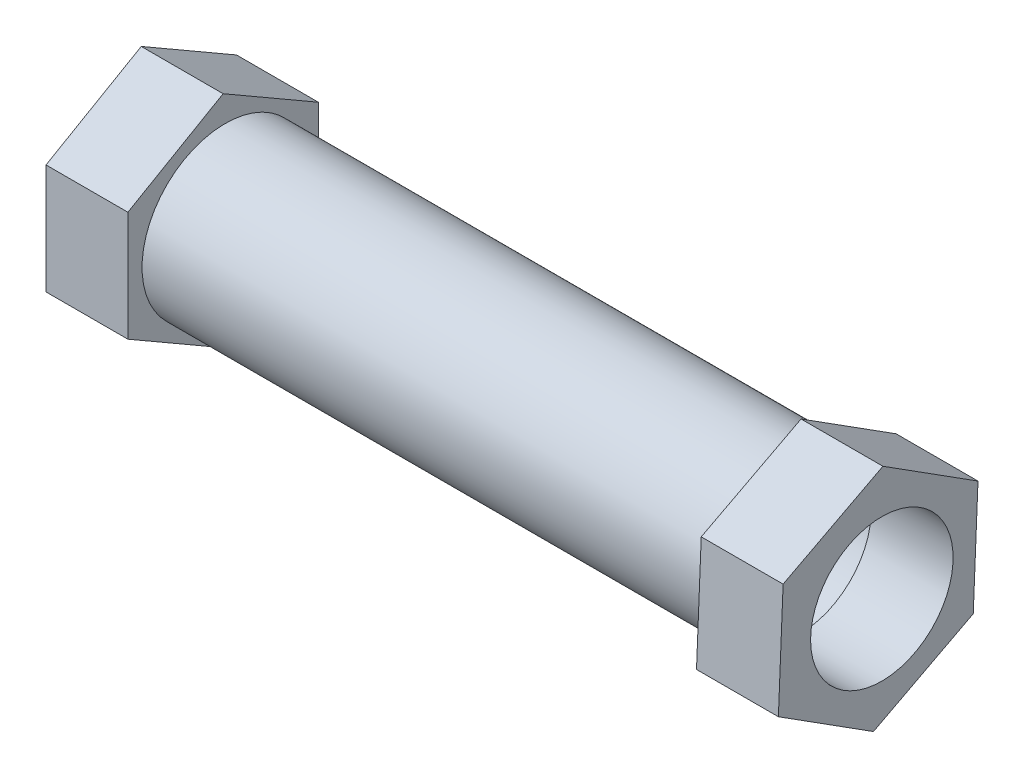
ISO-10303-21;
HEADER;
FILE_DESCRIPTION(('STEP AP214'),'2;1');
FILE_NAME('part.step','',(''),(''),'','','');
FILE_SCHEMA(('AUTOMOTIVE_DESIGN { 1 0 10303 214 1 1 1 1 }'));
ENDSEC;
DATA;
#1=APPLICATION_CONTEXT('core data for automotive mechanical design processes');
#2=APPLICATION_PROTOCOL_DEFINITION('international standard','automotive_design',2000,#1);
#3=PRODUCT_CONTEXT('',#1,'mechanical');
#4=PRODUCT('Part','Part','',(#3));
#5=PRODUCT_RELATED_PRODUCT_CATEGORY('part','',(#4));
#6=PRODUCT_DEFINITION_FORMATION('','',#4);
#7=PRODUCT_DEFINITION_CONTEXT('part definition',#1,'design');
#8=PRODUCT_DEFINITION('design','',#6,#7);
#9=PRODUCT_DEFINITION_SHAPE('','',#8);
#10=(LENGTH_UNIT() NAMED_UNIT(*) SI_UNIT(.MILLI.,.METRE.));
#11=(NAMED_UNIT(*) PLANE_ANGLE_UNIT() SI_UNIT($,.RADIAN.));
#12=(NAMED_UNIT(*) SI_UNIT($,.STERADIAN.) SOLID_ANGLE_UNIT());
#13=UNCERTAINTY_MEASURE_WITH_UNIT(LENGTH_MEASURE(1.E-05),#10,'distance_accuracy_value','');
#14=(GEOMETRIC_REPRESENTATION_CONTEXT(3) GLOBAL_UNCERTAINTY_ASSIGNED_CONTEXT((#13)) GLOBAL_UNIT_ASSIGNED_CONTEXT((#10,
#11,#12)) REPRESENTATION_CONTEXT('',''));
#15=CARTESIAN_POINT('',(0.,0.,0.));
#16=DIRECTION('',(0.,0.,1.));
#17=DIRECTION('',(1.,0.,0.));
#18=AXIS2_PLACEMENT_3D('',#15,#16,#17);
#19=CARTESIAN_POINT('',(350.,0.,-1.28970231793346));
#20=DIRECTION('',(-1.,0.,0.));
#21=DIRECTION('',(0.,0.,1.));
#22=AXIS2_PLACEMENT_3D('',#19,#20,#21);
#23=CYLINDRICAL_SURFACE('',#22,50.8003751134074);
#24=CARTESIAN_POINT('',(350.,0.,-1.28970231793346));
#25=DIRECTION('',(1.,0.,0.));
#26=DIRECTION('',(0.,0.,-1.));
#27=AXIS2_PLACEMENT_3D('',#24,#25,#26);
#28=CIRCLE('',#27,50.8003751134074);
#29=CARTESIAN_POINT('',(350.,0.,-52.0900774313409));
#30=VERTEX_POINT('',#29);
#31=EDGE_CURVE('E11',#30,#30,#28,.T.);
#32=ORIENTED_EDGE('',*,*,#31,.F.);
#33=EDGE_LOOP('',(#32));
#34=FACE_BOUND('',#33,.T.);
#35=CARTESIAN_POINT('',(0.,0.,-1.28970231793346));
#36=DIRECTION('',(1.,0.,0.));
#37=DIRECTION('',(0.,0.,-1.));
#38=AXIS2_PLACEMENT_3D('',#35,#36,#37);
#39=CIRCLE('',#38,50.8003751134074);
#40=CARTESIAN_POINT('',(0.,0.,-52.0900774313409));
#41=VERTEX_POINT('',#40);
#42=EDGE_CURVE('E36',#41,#41,#39,.T.);
#43=ORIENTED_EDGE('',*,*,#42,.T.);
#44=EDGE_LOOP('',(#43));
#45=FACE_BOUND('',#44,.T.);
#46=ADVANCED_FACE('F33',(#34,#45),#23,.T.);
#47=CARTESIAN_POINT('',(350.,0.,-1.28970231793346));
#48=DIRECTION('',(-1.,0.,0.));
#49=DIRECTION('',(0.,0.,1.));
#50=AXIS2_PLACEMENT_3D('',#47,#48,#49);
#51=CYLINDRICAL_SURFACE('',#50,47.812951640793);
#52=CARTESIAN_POINT('',(350.,0.,-1.28970231793346));
#53=DIRECTION('',(1.,0.,0.));
#54=DIRECTION('',(0.,0.,-1.));
#55=AXIS2_PLACEMENT_3D('',#52,#53,#54);
#56=CIRCLE('',#55,47.812951640793);
#57=CARTESIAN_POINT('',(350.,0.,-49.1026539587264));
#58=VERTEX_POINT('',#57);
#59=EDGE_CURVE('E142',#58,#58,#56,.T.);
#60=ORIENTED_EDGE('',*,*,#59,.T.);
#61=EDGE_LOOP('',(#60));
#62=FACE_BOUND('',#61,.T.);
#63=CARTESIAN_POINT('',(0.,0.,-1.28970231793346));
#64=DIRECTION('',(1.,0.,0.));
#65=DIRECTION('',(0.,0.,-1.));
#66=AXIS2_PLACEMENT_3D('',#63,#64,#65);
#67=CIRCLE('',#66,47.812951640793);
#68=CARTESIAN_POINT('',(0.,0.,-49.1026539587264));
#69=VERTEX_POINT('',#68);
#70=EDGE_CURVE('E42',#69,#69,#67,.T.);
#71=ORIENTED_EDGE('',*,*,#70,.F.);
#72=EDGE_LOOP('',(#71));
#73=FACE_BOUND('',#72,.T.);
#74=ADVANCED_FACE('F150',(#62,#73),#51,.F.);
#75=CARTESIAN_POINT('',(350.,0.,0.));
#76=DIRECTION('',(1.,0.,0.));
#77=DIRECTION('',(0.,0.,-1.));
#78=AXIS2_PLACEMENT_3D('',#75,#76,#77);
#79=PLANE('',#78);
#80=CARTESIAN_POINT('',(350.,-1.09442531969695,-2.23147845243465));
#81=DIRECTION('',(-1.,0.,0.));
#82=DIRECTION('',(0.,0.,1.));
#83=AXIS2_PLACEMENT_3D('',#80,#81,#82);
#84=CIRCLE('',#83,43.5178984979552);
#85=CARTESIAN_POINT('',(350.,-1.09442531969695,41.2864200455205));
#86=VERTEX_POINT('',#85);
#87=EDGE_CURVE('E233',#86,#86,#84,.T.);
#88=ORIENTED_EDGE('',*,*,#87,.F.);
#89=EDGE_LOOP('',(#88));
#90=FACE_BOUND('',#89,.T.);
#91=ORIENTED_EDGE('',*,*,#59,.F.);
#92=EDGE_LOOP('',(#91));
#93=FACE_BOUND('',#92,.T.);
#94=ADVANCED_FACE('F152',(#90,#93),#79,.F.);
#95=CARTESIAN_POINT('',(400.,0.,0.));
#96=DIRECTION('',(1.,0.,0.));
#97=DIRECTION('',(0.,0.,-1.));
#98=AXIS2_PLACEMENT_3D('',#95,#96,#97);
#99=PLANE('',#98);
#100=CARTESIAN_POINT('',(400.,-1.09442531969695,-2.23147845243465));
#101=DIRECTION('',(-1.,0.,0.));
#102=DIRECTION('',(0.,0.,1.));
#103=AXIS2_PLACEMENT_3D('',#100,#101,#102);
#104=CIRCLE('',#103,43.5178984979552);
#105=CARTESIAN_POINT('',(400.,-1.09442531969695,41.2864200455205));
#106=VERTEX_POINT('',#105);
#107=EDGE_CURVE('E230',#106,#106,#104,.T.);
#108=ORIENTED_EDGE('',*,*,#107,.T.);
#109=EDGE_LOOP('',(#108));
#110=FACE_BOUND('',#109,.T.);
#111=DIRECTION('',(0.,0.463163450714565,-0.886272880055673));
#112=VECTOR('',#111,1.);
#113=CARTESIAN_POINT('',(400.,-68.7053503173919,2.88990405047424));
#114=LINE('',#113,#112);
#115=CARTESIAN_POINT('',(400.,-68.7053503173919,2.88990405047424));
#116=VERTEX_POINT('',#115);
#117=CARTESIAN_POINT('',(400.,-36.8554054809062,-58.0556267255335));
#118=VERTEX_POINT('',#117);
#119=EDGE_CURVE('E133',#116,#118,#114,.T.);
#120=ORIENTED_EDGE('',*,*,#119,.T.);
#121=DIRECTION('',(0.,0.999116554170694,-0.0420251256045614));
#122=VECTOR('',#121,1.);
#123=CARTESIAN_POINT('',(400.,-36.8554054809062,-58.0556267255335));
#124=LINE('',#123,#122);
#125=CARTESIAN_POINT('',(400.,31.8499448364857,-60.9455307760078));
#126=VERTEX_POINT('',#125);
#127=EDGE_CURVE('E89',#118,#126,#124,.T.);
#128=ORIENTED_EDGE('',*,*,#127,.T.);
#129=DIRECTION('',(0.,0.535953103456129,0.844247754451111));
#130=VECTOR('',#129,1.);
#131=CARTESIAN_POINT('',(400.,31.8499448364857,-60.9455307760078));
#132=LINE('',#131,#130);
#133=CARTESIAN_POINT('',(400.,68.7053503173919,-2.88990405047429));
#134=VERTEX_POINT('',#133);
#135=EDGE_CURVE('E105',#126,#134,#132,.T.);
#136=ORIENTED_EDGE('',*,*,#135,.T.);
#137=DIRECTION('',(0.,-0.463163450714565,0.886272880055673));
#138=VECTOR('',#137,1.);
#139=CARTESIAN_POINT('',(400.,68.7053503173919,-2.88990405047429));
#140=LINE('',#139,#138);
#141=CARTESIAN_POINT('',(400.,36.8554054809062,58.0556267255335));
#142=VERTEX_POINT('',#141);
#143=EDGE_CURVE('E99',#134,#142,#140,.T.);
#144=ORIENTED_EDGE('',*,*,#143,.T.);
#145=DIRECTION('',(0.,-0.999116554170694,0.0420251256045615));
#146=VECTOR('',#145,1.);
#147=CARTESIAN_POINT('',(400.,36.8554054809062,58.0556267255335));
#148=LINE('',#147,#146);
#149=CARTESIAN_POINT('',(400.,-31.8499448364857,60.9455307760078));
#150=VERTEX_POINT('',#149);
#151=EDGE_CURVE('E103',#142,#150,#148,.T.);
#152=ORIENTED_EDGE('',*,*,#151,.T.);
#153=DIRECTION('',(0.,-0.535953103456129,-0.844247754451111));
#154=VECTOR('',#153,1.);
#155=CARTESIAN_POINT('',(400.,-31.8499448364857,60.9455307760078));
#156=LINE('',#155,#154);
#157=EDGE_CURVE('E50',#150,#116,#156,.T.);
#158=ORIENTED_EDGE('',*,*,#157,.T.);
#159=EDGE_LOOP('',(#120,#128,#136,#144,#152,#158));
#160=FACE_BOUND('',#159,.T.);
#161=ADVANCED_FACE('F101',(#110,#160),#99,.T.);
#162=ORIENTED_EDGE('',*,*,#31,.T.);
#163=EDGE_LOOP('',(#162));
#164=FACE_BOUND('',#163,.T.);
#165=DIRECTION('',(0.,0.463163450714565,-0.886272880055673));
#166=VECTOR('',#165,1.);
#167=CARTESIAN_POINT('',(350.,-68.7053503173919,2.88990405047424));
#168=LINE('',#167,#166);
#169=CARTESIAN_POINT('',(350.,-68.7053503173919,2.88990405047424));
#170=VERTEX_POINT('',#169);
#171=CARTESIAN_POINT('',(350.,-36.8554054809062,-58.0556267255335));
#172=VERTEX_POINT('',#171);
#173=EDGE_CURVE('E123',#170,#172,#168,.T.);
#174=ORIENTED_EDGE('',*,*,#173,.F.);
#175=DIRECTION('',(0.,-0.535953103456129,-0.844247754451111));
#176=VECTOR('',#175,1.);
#177=CARTESIAN_POINT('',(350.,-31.8499448364857,60.9455307760078));
#178=LINE('',#177,#176);
#179=CARTESIAN_POINT('',(350.,-31.8499448364857,60.9455307760078));
#180=VERTEX_POINT('',#179);
#181=EDGE_CURVE('E80',#180,#170,#178,.T.);
#182=ORIENTED_EDGE('',*,*,#181,.F.);
#183=DIRECTION('',(0.,-0.999116554170694,0.0420251256045615));
#184=VECTOR('',#183,1.);
#185=CARTESIAN_POINT('',(350.,36.8554054809062,58.0556267255335));
#186=LINE('',#185,#184);
#187=CARTESIAN_POINT('',(350.,36.8554054809062,58.0556267255335));
#188=VERTEX_POINT('',#187);
#189=EDGE_CURVE('E74',#188,#180,#186,.T.);
#190=ORIENTED_EDGE('',*,*,#189,.F.);
#191=DIRECTION('',(0.,-0.463163450714565,0.886272880055673));
#192=VECTOR('',#191,1.);
#193=CARTESIAN_POINT('',(350.,68.7053503173919,-2.88990405047429));
#194=LINE('',#193,#192);
#195=CARTESIAN_POINT('',(350.,68.7053503173919,-2.88990405047429));
#196=VERTEX_POINT('',#195);
#197=EDGE_CURVE('E113',#196,#188,#194,.T.);
#198=ORIENTED_EDGE('',*,*,#197,.F.);
#199=DIRECTION('',(0.,0.535953103456129,0.844247754451111));
#200=VECTOR('',#199,1.);
#201=CARTESIAN_POINT('',(350.,31.8499448364857,-60.9455307760078));
#202=LINE('',#201,#200);
#203=CARTESIAN_POINT('',(350.,31.8499448364857,-60.9455307760078));
#204=VERTEX_POINT('',#203);
#205=EDGE_CURVE('E128',#204,#196,#202,.T.);
#206=ORIENTED_EDGE('',*,*,#205,.F.);
#207=DIRECTION('',(0.,0.999116554170694,-0.0420251256045614));
#208=VECTOR('',#207,1.);
#209=CARTESIAN_POINT('',(350.,-36.8554054809062,-58.0556267255335));
#210=LINE('',#209,#208);
#211=EDGE_CURVE('E126',#172,#204,#210,.T.);
#212=ORIENTED_EDGE('',*,*,#211,.F.);
#213=EDGE_LOOP('',(#174,#182,#190,#198,#206,#212));
#214=FACE_BOUND('',#213,.T.);
#215=ADVANCED_FACE('F160',(#164,#214),#79,.F.);
#216=CARTESIAN_POINT('',(400.,-68.7053503173919,2.88990405047424));
#217=DIRECTION('',(0.,0.886272880055673,0.463163450714565));
#218=DIRECTION('',(0.,-0.463163450714565,0.886272880055673));
#219=AXIS2_PLACEMENT_3D('',#216,#217,#218);
#220=PLANE('',#219);
#221=ORIENTED_EDGE('',*,*,#173,.T.);
#222=DIRECTION('',(-1.,0.,0.));
#223=VECTOR('',#222,1.);
#224=CARTESIAN_POINT('',(400.,-36.8554054809062,-58.0556267255335));
#225=LINE('',#224,#223);
#226=EDGE_CURVE('E140',#118,#172,#225,.T.);
#227=ORIENTED_EDGE('',*,*,#226,.F.);
#228=ORIENTED_EDGE('',*,*,#119,.F.);
#229=DIRECTION('',(-1.,0.,0.));
#230=VECTOR('',#229,1.);
#231=CARTESIAN_POINT('',(400.,-68.7053503173919,2.88990405047424));
#232=LINE('',#231,#230);
#233=EDGE_CURVE('E119',#116,#170,#232,.T.);
#234=ORIENTED_EDGE('',*,*,#233,.T.);
#235=EDGE_LOOP('',(#221,#227,#228,#234));
#236=FACE_BOUND('',#235,.T.);
#237=ADVANCED_FACE('F163',(#236),#220,.F.);
#238=CARTESIAN_POINT('',(400.,-36.8554054809062,-58.0556267255335));
#239=DIRECTION('',(0.,0.0420251256045614,0.999116554170694));
#240=DIRECTION('',(0.,-0.999116554170694,0.0420251256045614));
#241=AXIS2_PLACEMENT_3D('',#238,#239,#240);
#242=PLANE('',#241);
#243=ORIENTED_EDGE('',*,*,#211,.T.);
#244=DIRECTION('',(-1.,0.,0.));
#245=VECTOR('',#244,1.);
#246=CARTESIAN_POINT('',(400.,31.8499448364857,-60.9455307760078));
#247=LINE('',#246,#245);
#248=EDGE_CURVE('E137',#126,#204,#247,.T.);
#249=ORIENTED_EDGE('',*,*,#248,.F.);
#250=ORIENTED_EDGE('',*,*,#127,.F.);
#251=ORIENTED_EDGE('',*,*,#226,.T.);
#252=EDGE_LOOP('',(#243,#249,#250,#251));
#253=FACE_BOUND('',#252,.T.);
#254=ADVANCED_FACE('F166',(#253),#242,.F.);
#255=CARTESIAN_POINT('',(400.,31.8499448364857,-60.9455307760078));
#256=DIRECTION('',(0.,-0.844247754451111,0.535953103456129));
#257=DIRECTION('',(0.,-0.535953103456129,-0.844247754451111));
#258=AXIS2_PLACEMENT_3D('',#255,#256,#257);
#259=PLANE('',#258);
#260=ORIENTED_EDGE('',*,*,#205,.T.);
#261=DIRECTION('',(-1.,0.,0.));
#262=VECTOR('',#261,1.);
#263=CARTESIAN_POINT('',(400.,68.7053503173919,-2.88990405047429));
#264=LINE('',#263,#262);
#265=EDGE_CURVE('E114',#134,#196,#264,.T.);
#266=ORIENTED_EDGE('',*,*,#265,.F.);
#267=ORIENTED_EDGE('',*,*,#135,.F.);
#268=ORIENTED_EDGE('',*,*,#248,.T.);
#269=EDGE_LOOP('',(#260,#266,#267,#268));
#270=FACE_BOUND('',#269,.T.);
#271=ADVANCED_FACE('F170',(#270),#259,.F.);
#272=CARTESIAN_POINT('',(400.,68.7053503173919,-2.88990405047429));
#273=DIRECTION('',(0.,-0.886272880055673,-0.463163450714565));
#274=DIRECTION('',(0.,0.463163450714565,-0.886272880055673));
#275=AXIS2_PLACEMENT_3D('',#272,#273,#274);
#276=PLANE('',#275);
#277=ORIENTED_EDGE('',*,*,#197,.T.);
#278=DIRECTION('',(-1.,0.,0.));
#279=VECTOR('',#278,1.);
#280=CARTESIAN_POINT('',(400.,36.8554054809062,58.0556267255335));
#281=LINE('',#280,#279);
#282=EDGE_CURVE('E110',#142,#188,#281,.T.);
#283=ORIENTED_EDGE('',*,*,#282,.F.);
#284=ORIENTED_EDGE('',*,*,#143,.F.);
#285=ORIENTED_EDGE('',*,*,#265,.T.);
#286=EDGE_LOOP('',(#277,#283,#284,#285));
#287=FACE_BOUND('',#286,.T.);
#288=ADVANCED_FACE('F111',(#287),#276,.F.);
#289=CARTESIAN_POINT('',(400.,36.8554054809062,58.0556267255335));
#290=DIRECTION('',(0.,-0.0420251256045615,-0.999116554170694));
#291=DIRECTION('',(0.,0.999116554170694,-0.0420251256045615));
#292=AXIS2_PLACEMENT_3D('',#289,#290,#291);
#293=PLANE('',#292);
#294=ORIENTED_EDGE('',*,*,#189,.T.);
#295=DIRECTION('',(-1.,0.,0.));
#296=VECTOR('',#295,1.);
#297=CARTESIAN_POINT('',(400.,-31.8499448364857,60.9455307760078));
#298=LINE('',#297,#296);
#299=EDGE_CURVE('E115',#150,#180,#298,.T.);
#300=ORIENTED_EDGE('',*,*,#299,.F.);
#301=ORIENTED_EDGE('',*,*,#151,.F.);
#302=ORIENTED_EDGE('',*,*,#282,.T.);
#303=EDGE_LOOP('',(#294,#300,#301,#302));
#304=FACE_BOUND('',#303,.T.);
#305=ADVANCED_FACE('F117',(#304),#293,.F.);
#306=CARTESIAN_POINT('',(400.,-31.8499448364857,60.9455307760078));
#307=DIRECTION('',(0.,0.844247754451111,-0.535953103456129));
#308=DIRECTION('',(0.,0.535953103456129,0.844247754451111));
#309=AXIS2_PLACEMENT_3D('',#306,#307,#308);
#310=PLANE('',#309);
#311=ORIENTED_EDGE('',*,*,#181,.T.);
#312=ORIENTED_EDGE('',*,*,#233,.F.);
#313=ORIENTED_EDGE('',*,*,#157,.F.);
#314=ORIENTED_EDGE('',*,*,#299,.T.);
#315=EDGE_LOOP('',(#311,#312,#313,#314));
#316=FACE_BOUND('',#315,.T.);
#317=ADVANCED_FACE('F178',(#316),#310,.F.);
#318=CARTESIAN_POINT('',(0.,0.,0.));
#319=DIRECTION('',(-1.,0.,0.));
#320=DIRECTION('',(0.,0.,1.));
#321=AXIS2_PLACEMENT_3D('',#318,#319,#320);
#322=PLANE('',#321);
#323=CARTESIAN_POINT('',(0.,0.,-2.16727803402694));
#324=DIRECTION('',(1.,0.,0.));
#325=DIRECTION('',(0.,0.,-1.));
#326=AXIS2_PLACEMENT_3D('',#323,#324,#325);
#327=CIRCLE('',#326,44.9963180306759);
#328=CARTESIAN_POINT('',(0.,0.,-47.1635960647028));
#329=VERTEX_POINT('',#328);
#330=EDGE_CURVE('E235',#329,#329,#327,.T.);
#331=ORIENTED_EDGE('',*,*,#330,.F.);
#332=EDGE_LOOP('',(#331));
#333=FACE_BOUND('',#332,.T.);
#334=ORIENTED_EDGE('',*,*,#70,.T.);
#335=EDGE_LOOP('',(#334));
#336=FACE_BOUND('',#335,.T.);
#337=ADVANCED_FACE('F148',(#333,#336),#322,.F.);
#338=CARTESIAN_POINT('',(-50.,-33.5806765082707,-58.1634378648579));
#339=DIRECTION('',(0.,0.866025403784442,0.499999999999995));
#340=DIRECTION('',(0.,-0.499999999999995,0.866025403784442));
#341=AXIS2_PLACEMENT_3D('',#338,#339,#340);
#342=PLANE('',#341);
#343=DIRECTION('',(0.,-0.499999999999995,0.866025403784442));
#344=VECTOR('',#343,1.);
#345=CARTESIAN_POINT('',(0.,-33.5806765082707,-58.1634378648579));
#346=LINE('',#345,#344);
#347=CARTESIAN_POINT('',(0.,-33.5806765082707,-58.1634378648579));
#348=VERTEX_POINT('',#347);
#349=CARTESIAN_POINT('',(0.,-67.16135301654,0.));
#350=VERTEX_POINT('',#349);
#351=EDGE_CURVE('E241',#348,#350,#346,.T.);
#352=ORIENTED_EDGE('',*,*,#351,.T.);
#353=DIRECTION('',(1.,0.,0.));
#354=VECTOR('',#353,1.);
#355=CARTESIAN_POINT('',(-50.,-67.16135301654,0.));
#356=LINE('',#355,#354);
#357=CARTESIAN_POINT('',(-50.,-67.16135301654,0.));
#358=VERTEX_POINT('',#357);
#359=EDGE_CURVE('E294',#358,#350,#356,.T.);
#360=ORIENTED_EDGE('',*,*,#359,.F.);
#361=DIRECTION('',(0.,-0.499999999999995,0.866025403784442));
#362=VECTOR('',#361,1.);
#363=CARTESIAN_POINT('',(-50.,-33.5806765082707,-58.1634378648579));
#364=LINE('',#363,#362);
#365=CARTESIAN_POINT('',(-50.,-33.5806765082707,-58.1634378648579));
#366=VERTEX_POINT('',#365);
#367=EDGE_CURVE('E244',#366,#358,#364,.T.);
#368=ORIENTED_EDGE('',*,*,#367,.F.);
#369=DIRECTION('',(1.,0.,0.));
#370=VECTOR('',#369,1.);
#371=CARTESIAN_POINT('',(-50.,-33.5806765082707,-58.1634378648579));
#372=LINE('',#371,#370);
#373=EDGE_CURVE('E263',#366,#348,#372,.T.);
#374=ORIENTED_EDGE('',*,*,#373,.T.);
#375=EDGE_LOOP('',(#352,#360,#368,#374));
#376=FACE_BOUND('',#375,.T.);
#377=ADVANCED_FACE('F186',(#376),#342,.F.);
#378=CARTESIAN_POINT('',(-50.,-67.16135301654,0.));
#379=DIRECTION('',(0.,0.866025403784438,-0.500000000000001));
#380=DIRECTION('',(0.,0.500000000000001,0.866025403784438));
#381=AXIS2_PLACEMENT_3D('',#378,#379,#380);
#382=PLANE('',#381);
#383=DIRECTION('',(0.,0.500000000000001,0.866025403784438));
#384=VECTOR('',#383,1.);
#385=CARTESIAN_POINT('',(0.,-67.16135301654,0.));
#386=LINE('',#385,#384);
#387=CARTESIAN_POINT('',(0.,-33.5806765082699,58.1634378648584));
#388=VERTEX_POINT('',#387);
#389=EDGE_CURVE('E266',#350,#388,#386,.T.);
#390=ORIENTED_EDGE('',*,*,#389,.T.);
#391=DIRECTION('',(1.,0.,0.));
#392=VECTOR('',#391,1.);
#393=CARTESIAN_POINT('',(-50.,-33.5806765082699,58.1634378648584));
#394=LINE('',#393,#392);
#395=CARTESIAN_POINT('',(-50.,-33.5806765082699,58.1634378648584));
#396=VERTEX_POINT('',#395);
#397=EDGE_CURVE('E291',#396,#388,#394,.T.);
#398=ORIENTED_EDGE('',*,*,#397,.F.);
#399=DIRECTION('',(0.,0.500000000000001,0.866025403784438));
#400=VECTOR('',#399,1.);
#401=CARTESIAN_POINT('',(-50.,-67.16135301654,0.));
#402=LINE('',#401,#400);
#403=EDGE_CURVE('E247',#358,#396,#402,.T.);
#404=ORIENTED_EDGE('',*,*,#403,.F.);
#405=ORIENTED_EDGE('',*,*,#359,.T.);
#406=EDGE_LOOP('',(#390,#398,#404,#405));
#407=FACE_BOUND('',#406,.T.);
#408=ADVANCED_FACE('F189',(#407),#382,.F.);
#409=CARTESIAN_POINT('',(-50.,-33.5806765082699,58.1634378648584));
#410=DIRECTION('',(0.,0.,-1.));
#411=DIRECTION('',(0.,1.,0.));
#412=AXIS2_PLACEMENT_3D('',#409,#410,#411);
#413=PLANE('',#412);
#414=DIRECTION('',(0.,1.,0.));
#415=VECTOR('',#414,1.);
#416=CARTESIAN_POINT('',(0.,-33.5806765082699,58.1634378648584));
#417=LINE('',#416,#415);
#418=CARTESIAN_POINT('',(0.,33.5806765082703,58.1634378648581));
#419=VERTEX_POINT('',#418);
#420=EDGE_CURVE('E269',#388,#419,#417,.T.);
#421=ORIENTED_EDGE('',*,*,#420,.T.);
#422=DIRECTION('',(1.,0.,0.));
#423=VECTOR('',#422,1.);
#424=CARTESIAN_POINT('',(-50.,33.5806765082703,58.1634378648581));
#425=LINE('',#424,#423);
#426=CARTESIAN_POINT('',(-50.,33.5806765082703,58.1634378648581));
#427=VERTEX_POINT('',#426);
#428=EDGE_CURVE('E288',#427,#419,#425,.T.);
#429=ORIENTED_EDGE('',*,*,#428,.F.);
#430=DIRECTION('',(0.,1.,0.));
#431=VECTOR('',#430,1.);
#432=CARTESIAN_POINT('',(-50.,-33.5806765082699,58.1634378648584));
#433=LINE('',#432,#431);
#434=EDGE_CURVE('E251',#396,#427,#433,.T.);
#435=ORIENTED_EDGE('',*,*,#434,.F.);
#436=ORIENTED_EDGE('',*,*,#397,.T.);
#437=EDGE_LOOP('',(#421,#429,#435,#436));
#438=FACE_BOUND('',#437,.T.);
#439=ADVANCED_FACE('F193',(#438),#413,.F.);
#440=CARTESIAN_POINT('',(-50.,33.5806765082703,58.1634378648581));
#441=DIRECTION('',(0.,-0.866025403784442,-0.499999999999995));
#442=DIRECTION('',(0.,0.499999999999995,-0.866025403784442));
#443=AXIS2_PLACEMENT_3D('',#440,#441,#442);
#444=PLANE('',#443);
#445=DIRECTION('',(0.,0.499999999999995,-0.866025403784442));
#446=VECTOR('',#445,1.);
#447=CARTESIAN_POINT('',(0.,33.5806765082703,58.1634378648581));
#448=LINE('',#447,#446);
#449=CARTESIAN_POINT('',(0.,67.16135301654,-4.68985221497411E-13));
#450=VERTEX_POINT('',#449);
#451=EDGE_CURVE('E272',#419,#450,#448,.T.);
#452=ORIENTED_EDGE('',*,*,#451,.T.);
#453=DIRECTION('',(1.,0.,0.));
#454=VECTOR('',#453,1.);
#455=CARTESIAN_POINT('',(-50.,67.16135301654,-4.68985221497411E-13));
#456=LINE('',#455,#454);
#457=CARTESIAN_POINT('',(-50.,67.16135301654,-4.68985221497411E-13));
#458=VERTEX_POINT('',#457);
#459=EDGE_CURVE('E285',#458,#450,#456,.T.);
#460=ORIENTED_EDGE('',*,*,#459,.F.);
#461=DIRECTION('',(0.,0.499999999999995,-0.866025403784442));
#462=VECTOR('',#461,1.);
#463=CARTESIAN_POINT('',(-50.,33.5806765082703,58.1634378648581));
#464=LINE('',#463,#462);
#465=EDGE_CURVE('E254',#427,#458,#464,.T.);
#466=ORIENTED_EDGE('',*,*,#465,.F.);
#467=ORIENTED_EDGE('',*,*,#428,.T.);
#468=EDGE_LOOP('',(#452,#460,#466,#467));
#469=FACE_BOUND('',#468,.T.);
#470=ADVANCED_FACE('F197',(#469),#444,.F.);
#471=CARTESIAN_POINT('',(-50.,67.16135301654,-4.68985221497411E-13));
#472=DIRECTION('',(0.,-0.866025403784435,0.500000000000007));
#473=DIRECTION('',(0.,-0.500000000000007,-0.866025403784435));
#474=AXIS2_PLACEMENT_3D('',#471,#472,#473);
#475=PLANE('',#474);
#476=DIRECTION('',(0.,-0.500000000000007,-0.866025403784435));
#477=VECTOR('',#476,1.);
#478=CARTESIAN_POINT('',(0.,67.16135301654,-4.68985221497411E-13));
#479=LINE('',#478,#477);
#480=CARTESIAN_POINT('',(0.,33.5806765082695,-58.1634378648586));
#481=VERTEX_POINT('',#480);
#482=EDGE_CURVE('E275',#450,#481,#479,.T.);
#483=ORIENTED_EDGE('',*,*,#482,.T.);
#484=DIRECTION('',(1.,0.,0.));
#485=VECTOR('',#484,1.);
#486=CARTESIAN_POINT('',(-50.,33.5806765082695,-58.1634378648586));
#487=LINE('',#486,#485);
#488=CARTESIAN_POINT('',(-50.,33.5806765082695,-58.1634378648586));
#489=VERTEX_POINT('',#488);
#490=EDGE_CURVE('E282',#489,#481,#487,.T.);
#491=ORIENTED_EDGE('',*,*,#490,.F.);
#492=DIRECTION('',(0.,-0.500000000000007,-0.866025403784435));
#493=VECTOR('',#492,1.);
#494=CARTESIAN_POINT('',(-50.,67.16135301654,-4.68985221497411E-13));
#495=LINE('',#494,#493);
#496=EDGE_CURVE('E257',#458,#489,#495,.T.);
#497=ORIENTED_EDGE('',*,*,#496,.F.);
#498=ORIENTED_EDGE('',*,*,#459,.T.);
#499=EDGE_LOOP('',(#483,#491,#497,#498));
#500=FACE_BOUND('',#499,.T.);
#501=ADVANCED_FACE('F201',(#500),#475,.F.);
#502=CARTESIAN_POINT('',(-50.,33.5806765082695,-58.1634378648586));
#503=DIRECTION('',(0.,0.,1.));
#504=DIRECTION('',(0.,-1.,0.));
#505=AXIS2_PLACEMENT_3D('',#502,#503,#504);
#506=PLANE('',#505);
#507=DIRECTION('',(0.,-1.,0.));
#508=VECTOR('',#507,1.);
#509=CARTESIAN_POINT('',(0.,33.5806765082695,-58.1634378648586));
#510=LINE('',#509,#508);
#511=EDGE_CURVE('E248',#481,#348,#510,.T.);
#512=ORIENTED_EDGE('',*,*,#511,.T.);
#513=ORIENTED_EDGE('',*,*,#373,.F.);
#514=DIRECTION('',(0.,-1.,0.));
#515=VECTOR('',#514,1.);
#516=CARTESIAN_POINT('',(-50.,33.5806765082695,-58.1634378648586));
#517=LINE('',#516,#515);
#518=EDGE_CURVE('E260',#489,#366,#517,.T.);
#519=ORIENTED_EDGE('',*,*,#518,.F.);
#520=ORIENTED_EDGE('',*,*,#490,.T.);
#521=EDGE_LOOP('',(#512,#513,#519,#520));
#522=FACE_BOUND('',#521,.T.);
#523=ADVANCED_FACE('F205',(#522),#506,.F.);
#524=CARTESIAN_POINT('',(-50.,0.,0.));
#525=DIRECTION('',(-1.,0.,0.));
#526=DIRECTION('',(0.,0.,1.));
#527=AXIS2_PLACEMENT_3D('',#524,#525,#526);
#528=PLANE('',#527);
#529=CARTESIAN_POINT('',(-50.,0.,-2.16727803402694));
#530=DIRECTION('',(1.,0.,0.));
#531=DIRECTION('',(0.,0.,-1.));
#532=AXIS2_PLACEMENT_3D('',#529,#530,#531);
#533=CIRCLE('',#532,44.9963180306759);
#534=CARTESIAN_POINT('',(-50.,0.,-47.1635960647028));
#535=VERTEX_POINT('',#534);
#536=EDGE_CURVE('E238',#535,#535,#533,.T.);
#537=ORIENTED_EDGE('',*,*,#536,.T.);
#538=EDGE_LOOP('',(#537));
#539=FACE_BOUND('',#538,.T.);
#540=ORIENTED_EDGE('',*,*,#367,.T.);
#541=ORIENTED_EDGE('',*,*,#403,.T.);
#542=ORIENTED_EDGE('',*,*,#434,.T.);
#543=ORIENTED_EDGE('',*,*,#465,.T.);
#544=ORIENTED_EDGE('',*,*,#496,.T.);
#545=ORIENTED_EDGE('',*,*,#518,.T.);
#546=EDGE_LOOP('',(#540,#541,#542,#543,#544,#545));
#547=FACE_BOUND('',#546,.T.);
#548=ADVANCED_FACE('F209',(#539,#547),#528,.T.);
#549=ORIENTED_EDGE('',*,*,#42,.F.);
#550=EDGE_LOOP('',(#549));
#551=FACE_BOUND('',#550,.T.);
#552=ORIENTED_EDGE('',*,*,#351,.F.);
#553=ORIENTED_EDGE('',*,*,#511,.F.);
#554=ORIENTED_EDGE('',*,*,#482,.F.);
#555=ORIENTED_EDGE('',*,*,#451,.F.);
#556=ORIENTED_EDGE('',*,*,#420,.F.);
#557=ORIENTED_EDGE('',*,*,#389,.F.);
#558=EDGE_LOOP('',(#552,#553,#554,#555,#556,#557));
#559=FACE_BOUND('',#558,.T.);
#560=ADVANCED_FACE('F211',(#551,#559),#322,.F.);
#561=CARTESIAN_POINT('',(-50.,0.,-2.16727803402694));
#562=DIRECTION('',(1.,0.,0.));
#563=DIRECTION('',(0.,0.,-1.));
#564=AXIS2_PLACEMENT_3D('',#561,#562,#563);
#565=CYLINDRICAL_SURFACE('',#564,44.9963180306759);
#566=ORIENTED_EDGE('',*,*,#536,.F.);
#567=EDGE_LOOP('',(#566));
#568=FACE_BOUND('',#567,.T.);
#569=ORIENTED_EDGE('',*,*,#330,.T.);
#570=EDGE_LOOP('',(#569));
#571=FACE_BOUND('',#570,.T.);
#572=ADVANCED_FACE('F214',(#568,#571),#565,.F.);
#573=CARTESIAN_POINT('',(400.,-1.09442531969695,-2.23147845243465));
#574=DIRECTION('',(-1.,0.,0.));
#575=DIRECTION('',(0.,0.,1.));
#576=AXIS2_PLACEMENT_3D('',#573,#574,#575);
#577=CYLINDRICAL_SURFACE('',#576,43.5178984979552);
#578=ORIENTED_EDGE('',*,*,#107,.F.);
#579=EDGE_LOOP('',(#578));
#580=FACE_BOUND('',#579,.T.);
#581=ORIENTED_EDGE('',*,*,#87,.T.);
#582=EDGE_LOOP('',(#581));
#583=FACE_BOUND('',#582,.T.);
#584=ADVANCED_FACE('F221',(#580,#583),#577,.F.);
#585=CLOSED_SHELL('',(#46,#74,#94,#161,#215,#237,#254,#271,#288,#305,#317,#337,#377,#408,#439,
#470,#501,#523,#548,#560,#572,#584));
#586=MANIFOLD_SOLID_BREP('B2',#585);
#587=ADVANCED_BREP_SHAPE_REPRESENTATION('',(#18,#586),#14);
#588=SHAPE_DEFINITION_REPRESENTATION(#9,#587);
ENDSEC;
END-ISO-10303-21;
